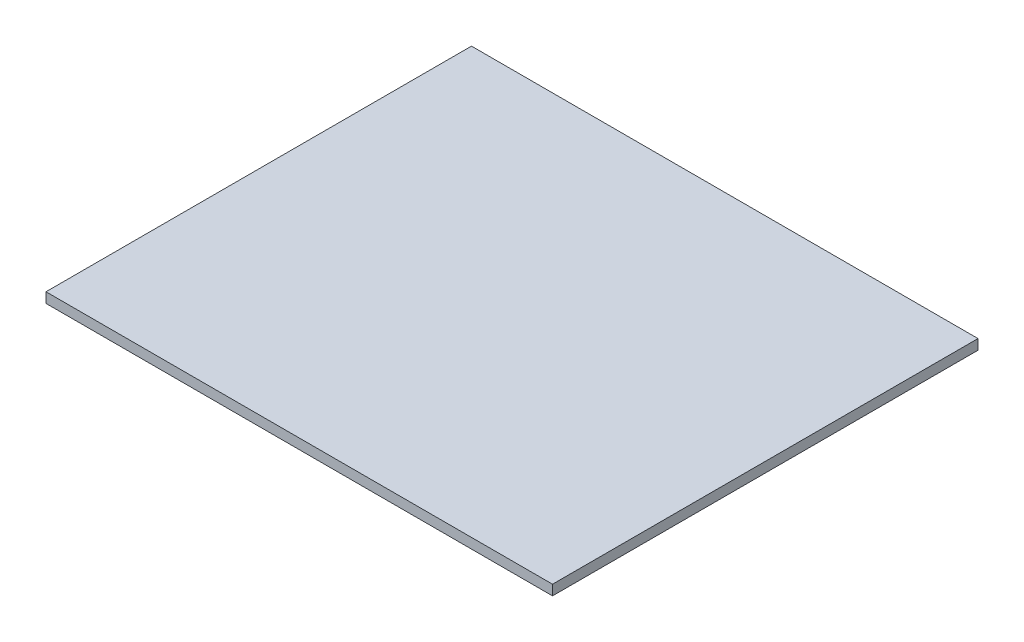
ISO-10303-21;
HEADER;
FILE_DESCRIPTION(('STEP AP214'),'2;1');
FILE_NAME('part.step','',(''),(''),'','','');
FILE_SCHEMA(('AUTOMOTIVE_DESIGN { 1 0 10303 214 1 1 1 1 }'));
ENDSEC;
DATA;
#1=APPLICATION_CONTEXT('core data for automotive mechanical design processes');
#2=APPLICATION_PROTOCOL_DEFINITION('international standard','automotive_design',2000,#1);
#3=PRODUCT_CONTEXT('',#1,'mechanical');
#4=PRODUCT('Part','Part','',(#3));
#5=PRODUCT_RELATED_PRODUCT_CATEGORY('part','',(#4));
#6=PRODUCT_DEFINITION_FORMATION('','',#4);
#7=PRODUCT_DEFINITION_CONTEXT('part definition',#1,'design');
#8=PRODUCT_DEFINITION('design','',#6,#7);
#9=PRODUCT_DEFINITION_SHAPE('','',#8);
#10=(LENGTH_UNIT() NAMED_UNIT(*) SI_UNIT(.MILLI.,.METRE.));
#11=(NAMED_UNIT(*) PLANE_ANGLE_UNIT() SI_UNIT($,.RADIAN.));
#12=(NAMED_UNIT(*) SI_UNIT($,.STERADIAN.) SOLID_ANGLE_UNIT());
#13=UNCERTAINTY_MEASURE_WITH_UNIT(LENGTH_MEASURE(1.E-05),#10,'distance_accuracy_value','');
#14=(GEOMETRIC_REPRESENTATION_CONTEXT(3) GLOBAL_UNCERTAINTY_ASSIGNED_CONTEXT((#13)) GLOBAL_UNIT_ASSIGNED_CONTEXT((#10,
#11,#12)) REPRESENTATION_CONTEXT('',''));
#15=CARTESIAN_POINT('',(0.,0.,0.));
#16=DIRECTION('',(0.,0.,1.));
#17=DIRECTION('',(1.,0.,0.));
#18=AXIS2_PLACEMENT_3D('',#15,#16,#17);
#19=CARTESIAN_POINT('',(-1250.,50.,1050.));
#20=DIRECTION('',(1.,0.,0.));
#21=DIRECTION('',(0.,0.,-1.));
#22=AXIS2_PLACEMENT_3D('',#19,#20,#21);
#23=PLANE('',#22);
#24=DIRECTION('',(0.,0.,1.));
#25=VECTOR('',#24,1.);
#26=CARTESIAN_POINT('',(-1250.,0.,1050.));
#27=LINE('',#26,#25);
#28=CARTESIAN_POINT('',(-1250.,0.,-1050.));
#29=VERTEX_POINT('',#28);
#30=CARTESIAN_POINT('',(-1250.,0.,1050.));
#31=VERTEX_POINT('',#30);
#32=EDGE_CURVE('E141',#29,#31,#27,.T.);
#33=ORIENTED_EDGE('',*,*,#32,.T.);
#34=DIRECTION('',(0.,-1.,0.));
#35=VECTOR('',#34,1.);
#36=CARTESIAN_POINT('',(-1250.,50.,1050.));
#37=LINE('',#36,#35);
#38=CARTESIAN_POINT('',(-1250.,50.,1050.));
#39=VERTEX_POINT('',#38);
#40=EDGE_CURVE('E11',#39,#31,#37,.T.);
#41=ORIENTED_EDGE('',*,*,#40,.F.);
#42=DIRECTION('',(0.,0.,1.));
#43=VECTOR('',#42,1.);
#44=CARTESIAN_POINT('',(-1250.,50.,1050.));
#45=LINE('',#44,#43);
#46=CARTESIAN_POINT('',(-1250.,50.,-1050.));
#47=VERTEX_POINT('',#46);
#48=EDGE_CURVE('E145',#47,#39,#45,.T.);
#49=ORIENTED_EDGE('',*,*,#48,.F.);
#50=DIRECTION('',(0.,-1.,0.));
#51=VECTOR('',#50,1.);
#52=CARTESIAN_POINT('',(-1250.,50.,-1050.));
#53=LINE('',#52,#51);
#54=EDGE_CURVE('E151',#47,#29,#53,.T.);
#55=ORIENTED_EDGE('',*,*,#54,.T.);
#56=EDGE_LOOP('',(#33,#41,#49,#55));
#57=FACE_BOUND('',#56,.T.);
#58=ADVANCED_FACE('F33',(#57),#23,.F.);
#59=CARTESIAN_POINT('',(1250.,50.,1050.));
#60=DIRECTION('',(0.,0.,-1.));
#61=DIRECTION('',(-1.,0.,0.));
#62=AXIS2_PLACEMENT_3D('',#59,#60,#61);
#63=PLANE('',#62);
#64=DIRECTION('',(1.,0.,0.));
#65=VECTOR('',#64,1.);
#66=CARTESIAN_POINT('',(1250.,0.,1050.));
#67=LINE('',#66,#65);
#68=CARTESIAN_POINT('',(1250.,0.,1050.));
#69=VERTEX_POINT('',#68);
#70=EDGE_CURVE('E154',#31,#69,#67,.T.);
#71=ORIENTED_EDGE('',*,*,#70,.T.);
#72=DIRECTION('',(0.,-1.,0.));
#73=VECTOR('',#72,1.);
#74=CARTESIAN_POINT('',(1250.,50.,1050.));
#75=LINE('',#74,#73);
#76=CARTESIAN_POINT('',(1250.,50.,1050.));
#77=VERTEX_POINT('',#76);
#78=EDGE_CURVE('E40',#77,#69,#75,.T.);
#79=ORIENTED_EDGE('',*,*,#78,.F.);
#80=DIRECTION('',(1.,0.,0.));
#81=VECTOR('',#80,1.);
#82=CARTESIAN_POINT('',(1250.,50.,1050.));
#83=LINE('',#82,#81);
#84=EDGE_CURVE('E84',#39,#77,#83,.T.);
#85=ORIENTED_EDGE('',*,*,#84,.F.);
#86=ORIENTED_EDGE('',*,*,#40,.T.);
#87=EDGE_LOOP('',(#71,#79,#85,#86));
#88=FACE_BOUND('',#87,.T.);
#89=ADVANCED_FACE('F182',(#88),#63,.F.);
#90=CARTESIAN_POINT('',(1250.,50.,1050.));
#91=DIRECTION('',(-1.,0.,0.));
#92=DIRECTION('',(0.,0.,1.));
#93=AXIS2_PLACEMENT_3D('',#90,#91,#92);
#94=PLANE('',#93);
#95=DIRECTION('',(0.,0.,-1.));
#96=VECTOR('',#95,1.);
#97=CARTESIAN_POINT('',(1250.,0.,1050.));
#98=LINE('',#97,#96);
#99=CARTESIAN_POINT('',(1250.,0.,-1050.));
#100=VERTEX_POINT('',#99);
#101=EDGE_CURVE('E156',#69,#100,#98,.T.);
#102=ORIENTED_EDGE('',*,*,#101,.T.);
#103=DIRECTION('',(0.,-1.,0.));
#104=VECTOR('',#103,1.);
#105=CARTESIAN_POINT('',(1250.,50.,-1050.));
#106=LINE('',#105,#104);
#107=CARTESIAN_POINT('',(1250.,50.,-1050.));
#108=VERTEX_POINT('',#107);
#109=EDGE_CURVE('E160',#108,#100,#106,.T.);
#110=ORIENTED_EDGE('',*,*,#109,.F.);
#111=DIRECTION('',(0.,0.,-1.));
#112=VECTOR('',#111,1.);
#113=CARTESIAN_POINT('',(1250.,50.,1050.));
#114=LINE('',#113,#112);
#115=EDGE_CURVE('E148',#77,#108,#114,.T.);
#116=ORIENTED_EDGE('',*,*,#115,.F.);
#117=ORIENTED_EDGE('',*,*,#78,.T.);
#118=EDGE_LOOP('',(#102,#110,#116,#117));
#119=FACE_BOUND('',#118,.T.);
#120=ADVANCED_FACE('F165',(#119),#94,.F.);
#121=CARTESIAN_POINT('',(1250.,50.,-1050.));
#122=DIRECTION('',(0.,0.,1.));
#123=DIRECTION('',(1.,0.,0.));
#124=AXIS2_PLACEMENT_3D('',#121,#122,#123);
#125=PLANE('',#124);
#126=DIRECTION('',(-1.,0.,0.));
#127=VECTOR('',#126,1.);
#128=CARTESIAN_POINT('',(1250.,0.,-1050.));
#129=LINE('',#128,#127);
#130=EDGE_CURVE('E77',#100,#29,#129,.T.);
#131=ORIENTED_EDGE('',*,*,#130,.T.);
#132=ORIENTED_EDGE('',*,*,#54,.F.);
#133=DIRECTION('',(-1.,0.,0.));
#134=VECTOR('',#133,1.);
#135=CARTESIAN_POINT('',(1250.,50.,-1050.));
#136=LINE('',#135,#134);
#137=EDGE_CURVE('E56',#108,#47,#136,.T.);
#138=ORIENTED_EDGE('',*,*,#137,.F.);
#139=ORIENTED_EDGE('',*,*,#109,.T.);
#140=EDGE_LOOP('',(#131,#132,#138,#139));
#141=FACE_BOUND('',#140,.T.);
#142=ADVANCED_FACE('F173',(#141),#125,.F.);
#143=CARTESIAN_POINT('',(0.,50.,0.));
#144=DIRECTION('',(0.,1.,0.));
#145=DIRECTION('',(0.,0.,1.));
#146=AXIS2_PLACEMENT_3D('',#143,#144,#145);
#147=PLANE('',#146);
#148=ORIENTED_EDGE('',*,*,#48,.T.);
#149=ORIENTED_EDGE('',*,*,#84,.T.);
#150=ORIENTED_EDGE('',*,*,#115,.T.);
#151=ORIENTED_EDGE('',*,*,#137,.T.);
#152=EDGE_LOOP('',(#148,#149,#150,#151));
#153=FACE_BOUND('',#152,.T.);
#154=ADVANCED_FACE('F175',(#153),#147,.T.);
#155=CARTESIAN_POINT('',(0.,0.,0.));
#156=DIRECTION('',(0.,1.,0.));
#157=DIRECTION('',(0.,0.,1.));
#158=AXIS2_PLACEMENT_3D('',#155,#156,#157);
#159=PLANE('',#158);
#160=DIRECTION('',(1.,0.,0.));
#161=VECTOR('',#160,1.);
#162=CARTESIAN_POINT('',(375.,0.,-375.));
#163=LINE('',#162,#161);
#164=CARTESIAN_POINT('',(-375.,0.,-375.));
#165=VERTEX_POINT('',#164);
#166=CARTESIAN_POINT('',(375.,0.,-375.));
#167=VERTEX_POINT('',#166);
#168=EDGE_CURVE('E135',#165,#167,#163,.T.);
#169=ORIENTED_EDGE('',*,*,#168,.F.);
#170=DIRECTION('',(0.,0.,-1.));
#171=VECTOR('',#170,1.);
#172=CARTESIAN_POINT('',(-375.,0.,-375.));
#173=LINE('',#172,#171);
#174=CARTESIAN_POINT('',(-375.,0.,375.));
#175=VERTEX_POINT('',#174);
#176=EDGE_CURVE('E47',#175,#165,#173,.T.);
#177=ORIENTED_EDGE('',*,*,#176,.F.);
#178=DIRECTION('',(-1.,0.,0.));
#179=VECTOR('',#178,1.);
#180=CARTESIAN_POINT('',(375.,0.,375.));
#181=LINE('',#180,#179);
#182=CARTESIAN_POINT('',(375.,0.,375.));
#183=VERTEX_POINT('',#182);
#184=EDGE_CURVE('E126',#183,#175,#181,.T.);
#185=ORIENTED_EDGE('',*,*,#184,.F.);
#186=DIRECTION('',(0.,0.,1.));
#187=VECTOR('',#186,1.);
#188=CARTESIAN_POINT('',(375.,0.,-375.));
#189=LINE('',#188,#187);
#190=EDGE_CURVE('E129',#167,#183,#189,.T.);
#191=ORIENTED_EDGE('',*,*,#190,.F.);
#192=EDGE_LOOP('',(#169,#177,#185,#191));
#193=FACE_BOUND('',#192,.T.);
#194=ORIENTED_EDGE('',*,*,#32,.F.);
#195=ORIENTED_EDGE('',*,*,#130,.F.);
#196=ORIENTED_EDGE('',*,*,#101,.F.);
#197=ORIENTED_EDGE('',*,*,#70,.F.);
#198=EDGE_LOOP('',(#194,#195,#196,#197));
#199=FACE_BOUND('',#198,.T.);
#200=ADVANCED_FACE('F169',(#193,#199),#159,.F.);
#201=CARTESIAN_POINT('',(-375.,10.,-375.));
#202=DIRECTION('',(-1.,0.,0.));
#203=DIRECTION('',(0.,0.,1.));
#204=AXIS2_PLACEMENT_3D('',#201,#202,#203);
#205=PLANE('',#204);
#206=ORIENTED_EDGE('',*,*,#176,.T.);
#207=DIRECTION('',(0.,-1.,0.));
#208=VECTOR('',#207,1.);
#209=CARTESIAN_POINT('',(-375.,10.,-375.));
#210=LINE('',#209,#208);
#211=CARTESIAN_POINT('',(-375.,10.,-375.));
#212=VERTEX_POINT('',#211);
#213=EDGE_CURVE('E104',#212,#165,#210,.T.);
#214=ORIENTED_EDGE('',*,*,#213,.F.);
#215=DIRECTION('',(0.,0.,-1.));
#216=VECTOR('',#215,1.);
#217=CARTESIAN_POINT('',(-375.,10.,-375.));
#218=LINE('',#217,#216);
#219=CARTESIAN_POINT('',(-375.,10.,375.));
#220=VERTEX_POINT('',#219);
#221=EDGE_CURVE('E108',#220,#212,#218,.T.);
#222=ORIENTED_EDGE('',*,*,#221,.F.);
#223=DIRECTION('',(0.,-1.,0.));
#224=VECTOR('',#223,1.);
#225=CARTESIAN_POINT('',(-375.,10.,375.));
#226=LINE('',#225,#224);
#227=EDGE_CURVE('E139',#220,#175,#226,.T.);
#228=ORIENTED_EDGE('',*,*,#227,.T.);
#229=EDGE_LOOP('',(#206,#214,#222,#228));
#230=FACE_BOUND('',#229,.T.);
#231=ADVANCED_FACE('F106',(#230),#205,.F.);
#232=CARTESIAN_POINT('',(375.,10.,375.));
#233=DIRECTION('',(0.,0.,1.));
#234=DIRECTION('',(1.,0.,0.));
#235=AXIS2_PLACEMENT_3D('',#232,#233,#234);
#236=PLANE('',#235);
#237=ORIENTED_EDGE('',*,*,#184,.T.);
#238=ORIENTED_EDGE('',*,*,#227,.F.);
#239=DIRECTION('',(-1.,0.,0.));
#240=VECTOR('',#239,1.);
#241=CARTESIAN_POINT('',(375.,10.,375.));
#242=LINE('',#241,#240);
#243=CARTESIAN_POINT('',(375.,10.,375.));
#244=VERTEX_POINT('',#243);
#245=EDGE_CURVE('E114',#244,#220,#242,.T.);
#246=ORIENTED_EDGE('',*,*,#245,.F.);
#247=DIRECTION('',(0.,-1.,0.));
#248=VECTOR('',#247,1.);
#249=CARTESIAN_POINT('',(375.,10.,375.));
#250=LINE('',#249,#248);
#251=EDGE_CURVE('E142',#244,#183,#250,.T.);
#252=ORIENTED_EDGE('',*,*,#251,.T.);
#253=EDGE_LOOP('',(#237,#238,#246,#252));
#254=FACE_BOUND('',#253,.T.);
#255=ADVANCED_FACE('F222',(#254),#236,.F.);
#256=CARTESIAN_POINT('',(375.,10.,-375.));
#257=DIRECTION('',(1.,0.,0.));
#258=DIRECTION('',(0.,0.,-1.));
#259=AXIS2_PLACEMENT_3D('',#256,#257,#258);
#260=PLANE('',#259);
#261=ORIENTED_EDGE('',*,*,#190,.T.);
#262=ORIENTED_EDGE('',*,*,#251,.F.);
#263=DIRECTION('',(0.,0.,1.));
#264=VECTOR('',#263,1.);
#265=CARTESIAN_POINT('',(375.,10.,-375.));
#266=LINE('',#265,#264);
#267=CARTESIAN_POINT('',(375.,10.,-375.));
#268=VERTEX_POINT('',#267);
#269=EDGE_CURVE('E122',#268,#244,#266,.T.);
#270=ORIENTED_EDGE('',*,*,#269,.F.);
#271=DIRECTION('',(0.,-1.,0.));
#272=VECTOR('',#271,1.);
#273=CARTESIAN_POINT('',(375.,10.,-375.));
#274=LINE('',#273,#272);
#275=EDGE_CURVE('E113',#268,#167,#274,.T.);
#276=ORIENTED_EDGE('',*,*,#275,.T.);
#277=EDGE_LOOP('',(#261,#262,#270,#276));
#278=FACE_BOUND('',#277,.T.);
#279=ADVANCED_FACE('F231',(#278),#260,.F.);
#280=CARTESIAN_POINT('',(375.,10.,-375.));
#281=DIRECTION('',(0.,0.,-1.));
#282=DIRECTION('',(-1.,0.,0.));
#283=AXIS2_PLACEMENT_3D('',#280,#281,#282);
#284=PLANE('',#283);
#285=ORIENTED_EDGE('',*,*,#168,.T.);
#286=ORIENTED_EDGE('',*,*,#275,.F.);
#287=DIRECTION('',(1.,0.,0.));
#288=VECTOR('',#287,1.);
#289=CARTESIAN_POINT('',(375.,10.,-375.));
#290=LINE('',#289,#288);
#291=EDGE_CURVE('E117',#212,#268,#290,.T.);
#292=ORIENTED_EDGE('',*,*,#291,.F.);
#293=ORIENTED_EDGE('',*,*,#213,.T.);
#294=EDGE_LOOP('',(#285,#286,#292,#293));
#295=FACE_BOUND('',#294,.T.);
#296=ADVANCED_FACE('F118',(#295),#284,.F.);
#297=CARTESIAN_POINT('',(0.,10.,0.));
#298=DIRECTION('',(0.,-1.,0.));
#299=DIRECTION('',(0.,0.,-1.));
#300=AXIS2_PLACEMENT_3D('',#297,#298,#299);
#301=PLANE('',#300);
#302=ORIENTED_EDGE('',*,*,#221,.T.);
#303=ORIENTED_EDGE('',*,*,#291,.T.);
#304=ORIENTED_EDGE('',*,*,#269,.T.);
#305=ORIENTED_EDGE('',*,*,#245,.T.);
#306=EDGE_LOOP('',(#302,#303,#304,#305));
#307=FACE_BOUND('',#306,.T.);
#308=ADVANCED_FACE('F124',(#307),#301,.T.);
#309=CLOSED_SHELL('',(#58,#89,#120,#142,#154,#200,#231,#255,#279,#296,#308));
#310=MANIFOLD_SOLID_BREP('B2',#309);
#311=ADVANCED_BREP_SHAPE_REPRESENTATION('',(#18,#310),#14);
#312=SHAPE_DEFINITION_REPRESENTATION(#9,#311);
ENDSEC;
END-ISO-10303-21;
